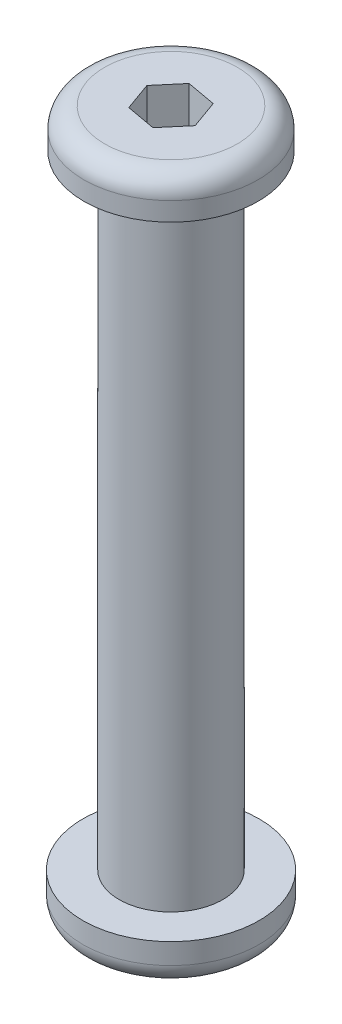
ISO-10303-21;
HEADER;
FILE_DESCRIPTION(('STEP AP214'),'2;1');
FILE_NAME('part.step','',(''),(''),'','','');
FILE_SCHEMA(('AUTOMOTIVE_DESIGN { 1 0 10303 214 1 1 1 1 }'));
ENDSEC;
DATA;
#1=APPLICATION_CONTEXT('core data for automotive mechanical design processes');
#2=APPLICATION_PROTOCOL_DEFINITION('international standard','automotive_design',2000,#1);
#3=PRODUCT_CONTEXT('',#1,'mechanical');
#4=PRODUCT('Part','Part','',(#3));
#5=PRODUCT_RELATED_PRODUCT_CATEGORY('part','',(#4));
#6=PRODUCT_DEFINITION_FORMATION('','',#4);
#7=PRODUCT_DEFINITION_CONTEXT('part definition',#1,'design');
#8=PRODUCT_DEFINITION('design','',#6,#7);
#9=PRODUCT_DEFINITION_SHAPE('','',#8);
#10=(LENGTH_UNIT() NAMED_UNIT(*) SI_UNIT(.MILLI.,.METRE.));
#11=(NAMED_UNIT(*) PLANE_ANGLE_UNIT() SI_UNIT($,.RADIAN.));
#12=(NAMED_UNIT(*) SI_UNIT($,.STERADIAN.) SOLID_ANGLE_UNIT());
#13=UNCERTAINTY_MEASURE_WITH_UNIT(LENGTH_MEASURE(1.E-05),#10,'distance_accuracy_value','');
#14=(GEOMETRIC_REPRESENTATION_CONTEXT(3) GLOBAL_UNCERTAINTY_ASSIGNED_CONTEXT((#13)) GLOBAL_UNIT_ASSIGNED_CONTEXT((#10,
#11,#12)) REPRESENTATION_CONTEXT('',''));
#15=CARTESIAN_POINT('',(0.,0.,0.));
#16=DIRECTION('',(0.,0.,1.));
#17=DIRECTION('',(1.,0.,0.));
#18=AXIS2_PLACEMENT_3D('',#15,#16,#17);
#19=CARTESIAN_POINT('',(0.,30.,0.));
#20=DIRECTION('',(0.,-1.,0.));
#21=DIRECTION('',(0.,0.,-1.));
#22=AXIS2_PLACEMENT_3D('',#19,#20,#21);
#23=CYLINDRICAL_SURFACE('',#22,2.5);
#24=CARTESIAN_POINT('',(0.,30.,0.));
#25=DIRECTION('',(0.,1.,0.));
#26=DIRECTION('',(0.,0.,1.));
#27=AXIS2_PLACEMENT_3D('',#24,#25,#26);
#28=CIRCLE('',#27,2.5);
#29=CARTESIAN_POINT('',(0.,30.,2.5));
#30=VERTEX_POINT('',#29);
#31=EDGE_CURVE('E278',#30,#30,#28,.T.);
#32=ORIENTED_EDGE('',*,*,#31,.F.);
#33=EDGE_LOOP('',(#32));
#34=FACE_BOUND('',#33,.T.);
#35=CARTESIAN_POINT('',(0.,0.,0.));
#36=DIRECTION('',(0.,-1.,0.));
#37=DIRECTION('',(0.,0.,-1.));
#38=AXIS2_PLACEMENT_3D('',#35,#36,#37);
#39=CIRCLE('',#38,2.5);
#40=CARTESIAN_POINT('',(0.,0.,-2.5));
#41=VERTEX_POINT('',#40);
#42=EDGE_CURVE('E210',#41,#41,#39,.T.);
#43=ORIENTED_EDGE('',*,*,#42,.F.);
#44=EDGE_LOOP('',(#43));
#45=FACE_BOUND('',#44,.T.);
#46=ADVANCED_FACE('F43',(#34,#45),#23,.T.);
#47=CARTESIAN_POINT('',(0.,31.9,0.));
#48=DIRECTION('',(0.,1.,0.));
#49=DIRECTION('',(0.,0.,1.));
#50=AXIS2_PLACEMENT_3D('',#47,#48,#49);
#51=PLANE('',#50);
#52=CARTESIAN_POINT('',(0.,31.9,0.));
#53=DIRECTION('',(0.,1.,0.));
#54=DIRECTION('',(0.,0.,1.));
#55=AXIS2_PLACEMENT_3D('',#52,#53,#54);
#56=CIRCLE('',#55,3.2);
#57=CARTESIAN_POINT('',(0.,31.9,3.2));
#58=VERTEX_POINT('',#57);
#59=EDGE_CURVE('E282',#58,#58,#56,.T.);
#60=ORIENTED_EDGE('',*,*,#59,.T.);
#61=EDGE_LOOP('',(#60));
#62=FACE_BOUND('',#61,.T.);
#63=DIRECTION('',(-0.983890145469255,0.,-0.178774107880554));
#64=VECTOR('',#63,1.);
#65=CARTESIAN_POINT('',(0.933529185275309,31.9,-1.10084358270035));
#66=LINE('',#65,#64);
#67=CARTESIAN_POINT('',(0.933529185275309,31.9,-1.10084358270035));
#68=VERTEX_POINT('',#67);
#69=CARTESIAN_POINT('',(-0.486593915573927,31.9,-1.35888178097279));
#70=VERTEX_POINT('',#69);
#71=EDGE_CURVE('E217',#68,#70,#66,.T.);
#72=ORIENTED_EDGE('',*,*,#71,.F.);
#73=DIRECTION('',(-0.337122153771169,0.,-0.941460914449818));
#74=VECTOR('',#73,1.);
#75=CARTESIAN_POINT('',(1.42012310084924,31.9,0.258038198272432));
#76=LINE('',#75,#74);
#77=CARTESIAN_POINT('',(1.42012310084924,31.9,0.258038198272432));
#78=VERTEX_POINT('',#77);
#79=EDGE_CURVE('E214',#78,#68,#76,.T.);
#80=ORIENTED_EDGE('',*,*,#79,.F.);
#81=DIRECTION('',(0.646767991698087,0.,-0.762686806569265));
#82=VECTOR('',#81,1.);
#83=CARTESIAN_POINT('',(0.486593915573928,31.9,1.35888178097278));
#84=LINE('',#83,#82);
#85=CARTESIAN_POINT('',(0.486593915573928,31.9,1.35888178097278));
#86=VERTEX_POINT('',#85);
#87=EDGE_CURVE('E231',#86,#78,#84,.T.);
#88=ORIENTED_EDGE('',*,*,#87,.F.);
#89=DIRECTION('',(0.983890145469255,0.,0.178774107880553));
#90=VECTOR('',#89,1.);
#91=CARTESIAN_POINT('',(-0.933529185275311,31.9,1.10084358270035));
#92=LINE('',#91,#90);
#93=CARTESIAN_POINT('',(-0.933529185275311,31.9,1.10084358270035));
#94=VERTEX_POINT('',#93);
#95=EDGE_CURVE('E227',#94,#86,#92,.T.);
#96=ORIENTED_EDGE('',*,*,#95,.F.);
#97=DIRECTION('',(0.337122153771169,0.,0.941460914449818));
#98=VECTOR('',#97,1.);
#99=CARTESIAN_POINT('',(-1.42012310084924,31.9,-0.258038198272431));
#100=LINE('',#99,#98);
#101=CARTESIAN_POINT('',(-1.42012310084924,31.9,-0.258038198272431));
#102=VERTEX_POINT('',#101);
#103=EDGE_CURVE('E224',#102,#94,#100,.T.);
#104=ORIENTED_EDGE('',*,*,#103,.F.);
#105=DIRECTION('',(-0.646767991698087,0.,0.762686806569266));
#106=VECTOR('',#105,1.);
#107=CARTESIAN_POINT('',(-0.486593915573927,31.9,-1.35888178097279));
#108=LINE('',#107,#106);
#109=EDGE_CURVE('E221',#70,#102,#108,.T.);
#110=ORIENTED_EDGE('',*,*,#109,.F.);
#111=EDGE_LOOP('',(#72,#80,#88,#96,#104,#110));
#112=FACE_BOUND('',#111,.T.);
#113=ADVANCED_FACE('F304',(#62,#112),#51,.T.);
#114=CARTESIAN_POINT('',(0.,30.,0.));
#115=DIRECTION('',(0.,1.,0.));
#116=DIRECTION('',(0.,0.,1.));
#117=AXIS2_PLACEMENT_3D('',#114,#115,#116);
#118=PLANE('',#117);
#119=ORIENTED_EDGE('',*,*,#31,.T.);
#120=EDGE_LOOP('',(#119));
#121=FACE_BOUND('',#120,.T.);
#122=CARTESIAN_POINT('',(0.,30.,0.));
#123=DIRECTION('',(0.,1.,0.));
#124=DIRECTION('',(0.,0.,1.));
#125=AXIS2_PLACEMENT_3D('',#122,#123,#124);
#126=CIRCLE('',#125,4.2);
#127=CARTESIAN_POINT('',(0.,30.,-4.2));
#128=VERTEX_POINT('',#127);
#129=EDGE_CURVE('E274',#128,#128,#126,.T.);
#130=ORIENTED_EDGE('',*,*,#129,.F.);
#131=EDGE_LOOP('',(#130));
#132=FACE_BOUND('',#131,.T.);
#133=ADVANCED_FACE('F310',(#121,#132),#118,.F.);
#134=CARTESIAN_POINT('',(0.,31.9,0.));
#135=DIRECTION('',(0.,-1.,0.));
#136=DIRECTION('',(0.,0.,-1.));
#137=AXIS2_PLACEMENT_3D('',#134,#135,#136);
#138=CYLINDRICAL_SURFACE('',#137,4.2);
#139=CARTESIAN_POINT('',(0.,30.9,0.));
#140=DIRECTION('',(0.,1.,0.));
#141=DIRECTION('',(0.,0.,1.));
#142=AXIS2_PLACEMENT_3D('',#139,#140,#141);
#143=CIRCLE('',#142,4.2);
#144=CARTESIAN_POINT('',(0.,30.9,-4.2));
#145=VERTEX_POINT('',#144);
#146=EDGE_CURVE('E286',#145,#145,#143,.F.);
#147=CARTESIAN_POINT('',(0.,30.9,-4.2));
#148=CARTESIAN_POINT('',(0.,30.890625,-4.2));
#149=CARTESIAN_POINT('',(0.,30.88125,-4.2));
#150=CARTESIAN_POINT('',(0.,30.8625,-4.2));
#151=CARTESIAN_POINT('',(0.,30.853125,-4.2));
#152=CARTESIAN_POINT('',(0.,30.834375,-4.2));
#153=CARTESIAN_POINT('',(0.,30.825,-4.2));
#154=CARTESIAN_POINT('',(0.,30.80625,-4.2));
#155=CARTESIAN_POINT('',(0.,30.796875,-4.2));
#156=CARTESIAN_POINT('',(0.,30.778125,-4.2));
#157=CARTESIAN_POINT('',(0.,30.76875,-4.2));
#158=CARTESIAN_POINT('',(0.,30.75,-4.2));
#159=CARTESIAN_POINT('',(0.,30.740625,-4.2));
#160=CARTESIAN_POINT('',(0.,30.721875,-4.2));
#161=CARTESIAN_POINT('',(0.,30.7125,-4.2));
#162=CARTESIAN_POINT('',(0.,30.69375,-4.2));
#163=CARTESIAN_POINT('',(0.,30.684375,-4.2));
#164=CARTESIAN_POINT('',(0.,30.665625,-4.2));
#165=CARTESIAN_POINT('',(0.,30.65625,-4.2));
#166=CARTESIAN_POINT('',(0.,30.6375,-4.2));
#167=CARTESIAN_POINT('',(0.,30.628125,-4.2));
#168=CARTESIAN_POINT('',(0.,30.609375,-4.2));
#169=CARTESIAN_POINT('',(0.,30.6,-4.2));
#170=CARTESIAN_POINT('',(0.,30.58125,-4.2));
#171=CARTESIAN_POINT('',(0.,30.571875,-4.2));
#172=CARTESIAN_POINT('',(0.,30.553125,-4.2));
#173=CARTESIAN_POINT('',(0.,30.54375,-4.2));
#174=CARTESIAN_POINT('',(0.,30.525,-4.2));
#175=CARTESIAN_POINT('',(0.,30.515625,-4.2));
#176=CARTESIAN_POINT('',(0.,30.496875,-4.2));
#177=CARTESIAN_POINT('',(0.,30.4875,-4.2));
#178=CARTESIAN_POINT('',(0.,30.46875,-4.2));
#179=CARTESIAN_POINT('',(0.,30.459375,-4.2));
#180=CARTESIAN_POINT('',(0.,30.440625,-4.2));
#181=CARTESIAN_POINT('',(0.,30.43125,-4.2));
#182=CARTESIAN_POINT('',(0.,30.4125,-4.2));
#183=CARTESIAN_POINT('',(0.,30.403125,-4.2));
#184=CARTESIAN_POINT('',(0.,30.384375,-4.2));
#185=CARTESIAN_POINT('',(0.,30.375,-4.2));
#186=CARTESIAN_POINT('',(0.,30.35625,-4.2));
#187=CARTESIAN_POINT('',(0.,30.346875,-4.2));
#188=CARTESIAN_POINT('',(0.,30.328125,-4.2));
#189=CARTESIAN_POINT('',(0.,30.31875,-4.2));
#190=CARTESIAN_POINT('',(0.,30.3,-4.2));
#191=CARTESIAN_POINT('',(0.,30.290625,-4.2));
#192=CARTESIAN_POINT('',(0.,30.271875,-4.2));
#193=CARTESIAN_POINT('',(0.,30.2625,-4.2));
#194=CARTESIAN_POINT('',(0.,30.24375,-4.2));
#195=CARTESIAN_POINT('',(0.,30.234375,-4.2));
#196=CARTESIAN_POINT('',(0.,30.215625,-4.2));
#197=CARTESIAN_POINT('',(0.,30.20625,-4.2));
#198=CARTESIAN_POINT('',(0.,30.1875,-4.2));
#199=CARTESIAN_POINT('',(0.,30.178125,-4.2));
#200=CARTESIAN_POINT('',(0.,30.159375,-4.2));
#201=CARTESIAN_POINT('',(0.,30.15,-4.2));
#202=CARTESIAN_POINT('',(0.,30.13125,-4.2));
#203=CARTESIAN_POINT('',(0.,30.121875,-4.2));
#204=CARTESIAN_POINT('',(0.,30.103125,-4.2));
#205=CARTESIAN_POINT('',(0.,30.09375,-4.2));
#206=CARTESIAN_POINT('',(0.,30.075,-4.2));
#207=CARTESIAN_POINT('',(0.,30.065625,-4.2));
#208=CARTESIAN_POINT('',(0.,30.046875,-4.2));
#209=CARTESIAN_POINT('',(0.,30.0375,-4.2));
#210=CARTESIAN_POINT('',(0.,30.01875,-4.2));
#211=CARTESIAN_POINT('',(0.,30.009375,-4.2));
#212=CARTESIAN_POINT('',(0.,30.,-4.2));
#213=B_SPLINE_CURVE_WITH_KNOTS('',3,(#147,#148,#149,#150,#151,#152,#153,#154,#155,#156,#157,
#158,#159,#160,#161,#162,#163,#164,#165,#166,#167,#168,#169,#170,#171,#172,#173,#174,#175,#176,
#177,#178,#179,#180,#181,#182,#183,#184,#185,#186,#187,#188,#189,#190,#191,#192,#193,#194,#195,
#196,#197,#198,#199,#200,#201,#202,#203,#204,#205,#206,#207,#208,#209,#210,#211,#212),
.UNSPECIFIED.,.F.,.F.,(4,2,2,2,2,2,2,2,2,2,2,2,2,2,2,2,2,2,2,2,2,2,2,2,2,2,2,2,2,2,2,2,4),(0.,
0.0281249999999969,0.0562499999999973,0.0843749999999976,0.112499999999998,0.140624999999998,
0.168749999999999,0.196874999999999,0.225,0.253124999999996,0.281249999999997,0.309374999999997,
0.337499999999998,0.365624999999998,0.393749999999998,0.421874999999999,0.449999999999999,
0.478124999999996,0.506249999999996,0.534374999999997,0.562499999999997,0.590624999999997,
0.618749999999998,0.646874999999998,0.674999999999998,0.703124999999995,0.731249999999996,
0.759374999999996,0.787499999999997,0.815624999999997,0.843749999999997,0.871874999999998,
0.899999999999998),.UNSPECIFIED.);
#214=EDGE_CURVE('BSEAM324',#145,#128,#213,.T.);
#215=ORIENTED_EDGE('',*,*,#146,.T.);
#216=ORIENTED_EDGE('',*,*,#129,.T.);
#217=ORIENTED_EDGE('',*,*,#214,.T.);
#218=ORIENTED_EDGE('',*,*,#214,.F.);
#219=EDGE_LOOP('',(#215,#217,#216,#218));
#220=FACE_BOUND('',#219,.T.);
#221=ADVANCED_FACE('F324',(#220),#138,.T.);
#222=CARTESIAN_POINT('',(1.42012310084924,31.9,0.258038198272432));
#223=DIRECTION('',(-0.941460914449818,0.,0.337122153771169));
#224=DIRECTION('',(0.337122153771169,0.,0.941460914449819));
#225=AXIS2_PLACEMENT_3D('',#222,#223,#224);
#226=PLANE('',#225);
#227=DIRECTION('',(-0.337122153771169,0.,-0.941460914449818));
#228=VECTOR('',#227,1.);
#229=CARTESIAN_POINT('',(1.42012310084924,30.,0.258038198272432));
#230=LINE('',#229,#228);
#231=CARTESIAN_POINT('',(1.42012310084924,30.,0.258038198272432));
#232=VERTEX_POINT('',#231);
#233=CARTESIAN_POINT('',(0.933529185275309,30.,-1.10084358270035));
#234=VERTEX_POINT('',#233);
#235=EDGE_CURVE('E67',#232,#234,#230,.T.);
#236=ORIENTED_EDGE('',*,*,#235,.F.);
#237=DIRECTION('',(0.,-1.,0.));
#238=VECTOR('',#237,1.);
#239=CARTESIAN_POINT('',(1.42012310084924,31.9,0.258038198272432));
#240=LINE('',#239,#238);
#241=EDGE_CURVE('E234',#78,#232,#240,.T.);
#242=ORIENTED_EDGE('',*,*,#241,.F.);
#243=ORIENTED_EDGE('',*,*,#79,.T.);
#244=DIRECTION('',(0.,-1.,0.));
#245=VECTOR('',#244,1.);
#246=CARTESIAN_POINT('',(0.933529185275309,31.9,-1.10084358270035));
#247=LINE('',#246,#245);
#248=EDGE_CURVE('E270',#68,#234,#247,.T.);
#249=ORIENTED_EDGE('',*,*,#248,.T.);
#250=EDGE_LOOP('',(#236,#242,#243,#249));
#251=FACE_BOUND('',#250,.T.);
#252=ADVANCED_FACE('F327',(#251),#226,.T.);
#253=CARTESIAN_POINT('',(0.933529185275309,31.9,-1.10084358270035));
#254=DIRECTION('',(-0.178774107880554,0.,0.983890145469255));
#255=DIRECTION('',(0.983890145469255,0.,0.178774107880554));
#256=AXIS2_PLACEMENT_3D('',#253,#254,#255);
#257=PLANE('',#256);
#258=DIRECTION('',(-0.983890145469255,0.,-0.178774107880554));
#259=VECTOR('',#258,1.);
#260=CARTESIAN_POINT('',(0.933529185275309,30.,-1.10084358270035));
#261=LINE('',#260,#259);
#262=CARTESIAN_POINT('',(-0.486593915573927,30.,-1.35888178097279));
#263=VERTEX_POINT('',#262);
#264=EDGE_CURVE('E237',#234,#263,#261,.T.);
#265=ORIENTED_EDGE('',*,*,#264,.F.);
#266=ORIENTED_EDGE('',*,*,#248,.F.);
#267=ORIENTED_EDGE('',*,*,#71,.T.);
#268=DIRECTION('',(0.,-1.,0.));
#269=VECTOR('',#268,1.);
#270=CARTESIAN_POINT('',(-0.486593915573927,31.9,-1.35888178097279));
#271=LINE('',#270,#269);
#272=EDGE_CURVE('E266',#70,#263,#271,.T.);
#273=ORIENTED_EDGE('',*,*,#272,.T.);
#274=EDGE_LOOP('',(#265,#266,#267,#273));
#275=FACE_BOUND('',#274,.T.);
#276=ADVANCED_FACE('F334',(#275),#257,.T.);
#277=CARTESIAN_POINT('',(-0.486593915573927,31.9,-1.35888178097279));
#278=DIRECTION('',(0.762686806569265,0.,0.646767991698086));
#279=DIRECTION('',(0.646767991698086,0.,-0.762686806569266));
#280=AXIS2_PLACEMENT_3D('',#277,#278,#279);
#281=PLANE('',#280);
#282=DIRECTION('',(-0.646767991698087,0.,0.762686806569266));
#283=VECTOR('',#282,1.);
#284=CARTESIAN_POINT('',(-0.486593915573927,30.,-1.35888178097279));
#285=LINE('',#284,#283);
#286=CARTESIAN_POINT('',(-1.42012310084924,30.,-0.258038198272431));
#287=VERTEX_POINT('',#286);
#288=EDGE_CURVE('E240',#263,#287,#285,.T.);
#289=ORIENTED_EDGE('',*,*,#288,.F.);
#290=ORIENTED_EDGE('',*,*,#272,.F.);
#291=ORIENTED_EDGE('',*,*,#109,.T.);
#292=DIRECTION('',(0.,-1.,0.));
#293=VECTOR('',#292,1.);
#294=CARTESIAN_POINT('',(-1.42012310084924,31.9,-0.258038198272431));
#295=LINE('',#294,#293);
#296=EDGE_CURVE('E262',#102,#287,#295,.T.);
#297=ORIENTED_EDGE('',*,*,#296,.T.);
#298=EDGE_LOOP('',(#289,#290,#291,#297));
#299=FACE_BOUND('',#298,.T.);
#300=ADVANCED_FACE('F338',(#299),#281,.T.);
#301=CARTESIAN_POINT('',(-1.42012310084924,31.9,-0.258038198272431));
#302=DIRECTION('',(0.941460914449818,0.,-0.337122153771169));
#303=DIRECTION('',(-0.337122153771169,0.,-0.941460914449818));
#304=AXIS2_PLACEMENT_3D('',#301,#302,#303);
#305=PLANE('',#304);
#306=DIRECTION('',(0.337122153771169,0.,0.941460914449818));
#307=VECTOR('',#306,1.);
#308=CARTESIAN_POINT('',(-1.42012310084924,30.,-0.258038198272431));
#309=LINE('',#308,#307);
#310=CARTESIAN_POINT('',(-0.933529185275311,30.,1.10084358270035));
#311=VERTEX_POINT('',#310);
#312=EDGE_CURVE('E243',#287,#311,#309,.T.);
#313=ORIENTED_EDGE('',*,*,#312,.F.);
#314=ORIENTED_EDGE('',*,*,#296,.F.);
#315=ORIENTED_EDGE('',*,*,#103,.T.);
#316=DIRECTION('',(0.,-1.,0.));
#317=VECTOR('',#316,1.);
#318=CARTESIAN_POINT('',(-0.933529185275311,31.9,1.10084358270035));
#319=LINE('',#318,#317);
#320=EDGE_CURVE('E258',#94,#311,#319,.T.);
#321=ORIENTED_EDGE('',*,*,#320,.T.);
#322=EDGE_LOOP('',(#313,#314,#315,#321));
#323=FACE_BOUND('',#322,.T.);
#324=ADVANCED_FACE('F342',(#323),#305,.T.);
#325=CARTESIAN_POINT('',(-0.933529185275311,31.9,1.10084358270035));
#326=DIRECTION('',(0.178774107880553,0.,-0.983890145469255));
#327=DIRECTION('',(-0.983890145469255,0.,-0.178774107880553));
#328=AXIS2_PLACEMENT_3D('',#325,#326,#327);
#329=PLANE('',#328);
#330=DIRECTION('',(0.983890145469255,0.,0.178774107880553));
#331=VECTOR('',#330,1.);
#332=CARTESIAN_POINT('',(-0.933529185275311,30.,1.10084358270035));
#333=LINE('',#332,#331);
#334=CARTESIAN_POINT('',(0.486593915573928,30.,1.35888178097278));
#335=VERTEX_POINT('',#334);
#336=EDGE_CURVE('E246',#311,#335,#333,.T.);
#337=ORIENTED_EDGE('',*,*,#336,.F.);
#338=ORIENTED_EDGE('',*,*,#320,.F.);
#339=ORIENTED_EDGE('',*,*,#95,.T.);
#340=DIRECTION('',(0.,-1.,0.));
#341=VECTOR('',#340,1.);
#342=CARTESIAN_POINT('',(0.486593915573928,31.9,1.35888178097278));
#343=LINE('',#342,#341);
#344=EDGE_CURVE('E254',#86,#335,#343,.T.);
#345=ORIENTED_EDGE('',*,*,#344,.T.);
#346=EDGE_LOOP('',(#337,#338,#339,#345));
#347=FACE_BOUND('',#346,.T.);
#348=ADVANCED_FACE('F346',(#347),#329,.T.);
#349=CARTESIAN_POINT('',(0.486593915573928,31.9,1.35888178097278));
#350=DIRECTION('',(-0.762686806569265,0.,-0.646767991698086));
#351=DIRECTION('',(-0.646767991698087,0.,0.762686806569265));
#352=AXIS2_PLACEMENT_3D('',#349,#350,#351);
#353=PLANE('',#352);
#354=DIRECTION('',(0.646767991698087,0.,-0.762686806569265));
#355=VECTOR('',#354,1.);
#356=CARTESIAN_POINT('',(0.486593915573928,30.,1.35888178097278));
#357=LINE('',#356,#355);
#358=EDGE_CURVE('E218',#335,#232,#357,.T.);
#359=ORIENTED_EDGE('',*,*,#358,.F.);
#360=ORIENTED_EDGE('',*,*,#344,.F.);
#361=ORIENTED_EDGE('',*,*,#87,.T.);
#362=ORIENTED_EDGE('',*,*,#241,.T.);
#363=EDGE_LOOP('',(#359,#360,#361,#362));
#364=FACE_BOUND('',#363,.T.);
#365=ADVANCED_FACE('F323',(#364),#353,.T.);
#366=CARTESIAN_POINT('',(0.,30.,0.));
#367=DIRECTION('',(0.,1.,0.));
#368=DIRECTION('',(0.,0.,1.));
#369=AXIS2_PLACEMENT_3D('',#366,#367,#368);
#370=PLANE('',#369);
#371=ORIENTED_EDGE('',*,*,#235,.T.);
#372=ORIENTED_EDGE('',*,*,#264,.T.);
#373=ORIENTED_EDGE('',*,*,#288,.T.);
#374=ORIENTED_EDGE('',*,*,#312,.T.);
#375=ORIENTED_EDGE('',*,*,#336,.T.);
#376=ORIENTED_EDGE('',*,*,#358,.T.);
#377=EDGE_LOOP('',(#371,#372,#373,#374,#375,#376));
#378=FACE_BOUND('',#377,.T.);
#379=ADVANCED_FACE('F320',(#378),#370,.T.);
#380=CARTESIAN_POINT('',(0.,-2.,0.));
#381=DIRECTION('',(0.,-1.,0.));
#382=DIRECTION('',(0.,0.,-1.));
#383=AXIS2_PLACEMENT_3D('',#380,#381,#382);
#384=PLANE('',#383);
#385=CARTESIAN_POINT('',(0.,-2.,0.));
#386=DIRECTION('',(0.,-1.,0.));
#387=DIRECTION('',(0.,0.,-1.));
#388=AXIS2_PLACEMENT_3D('',#385,#386,#387);
#389=CIRCLE('',#388,3.25);
#390=CARTESIAN_POINT('',(0.,-2.,-3.25));
#391=VERTEX_POINT('',#390);
#392=EDGE_CURVE('E52',#391,#391,#389,.T.);
#393=ORIENTED_EDGE('',*,*,#392,.T.);
#394=EDGE_LOOP('',(#393));
#395=FACE_BOUND('',#394,.T.);
#396=DIRECTION('',(-0.995901214221312,0.,0.0904476175060285));
#397=VECTOR('',#396,1.);
#398=CARTESIAN_POINT('',(0.831789314528723,-2.,1.17960157238331));
#399=LINE('',#398,#397);
#400=CARTESIAN_POINT('',(0.831789314528723,-2.,1.17960157238331));
#401=VERTEX_POINT('',#400);
#402=CARTESIAN_POINT('',(-0.605670270763652,-2.,1.31015146316997));
#403=VERTEX_POINT('',#402);
#404=EDGE_CURVE('E143',#401,#403,#399,.T.);
#405=ORIENTED_EDGE('',*,*,#404,.F.);
#406=DIRECTION('',(-0.419620672638657,0.,0.907699559928439));
#407=VECTOR('',#406,1.);
#408=CARTESIAN_POINT('',(1.43745958529237,-2.,-0.130549890786665));
#409=LINE('',#408,#407);
#410=CARTESIAN_POINT('',(1.43745958529237,-2.,-0.130549890786665));
#411=VERTEX_POINT('',#410);
#412=EDGE_CURVE('E134',#411,#401,#409,.T.);
#413=ORIENTED_EDGE('',*,*,#412,.F.);
#414=DIRECTION('',(0.576280541582655,0.,0.81725194242241));
#415=VECTOR('',#414,1.);
#416=CARTESIAN_POINT('',(0.605670270763651,-2.,-1.31015146316997));
#417=LINE('',#416,#415);
#418=CARTESIAN_POINT('',(0.605670270763652,-2.,-1.31015146316997));
#419=VERTEX_POINT('',#418);
#420=EDGE_CURVE('E171',#419,#411,#417,.T.);
#421=ORIENTED_EDGE('',*,*,#420,.F.);
#422=DIRECTION('',(0.995901214221312,0.,-0.090447617506028));
#423=VECTOR('',#422,1.);
#424=CARTESIAN_POINT('',(-0.831789314528721,-2.,-1.17960157238331));
#425=LINE('',#424,#423);
#426=CARTESIAN_POINT('',(-0.831789314528721,-2.,-1.17960157238331));
#427=VERTEX_POINT('',#426);
#428=EDGE_CURVE('E167',#427,#419,#425,.T.);
#429=ORIENTED_EDGE('',*,*,#428,.F.);
#430=DIRECTION('',(0.419620672638657,0.,-0.907699559928439));
#431=VECTOR('',#430,1.);
#432=CARTESIAN_POINT('',(-1.43745958529237,-2.,0.130549890786665));
#433=LINE('',#432,#431);
#434=CARTESIAN_POINT('',(-1.43745958529237,-2.,0.130549890786665));
#435=VERTEX_POINT('',#434);
#436=EDGE_CURVE('E162',#435,#427,#433,.T.);
#437=ORIENTED_EDGE('',*,*,#436,.F.);
#438=DIRECTION('',(-0.576280541582654,0.,-0.81725194242241));
#439=VECTOR('',#438,1.);
#440=CARTESIAN_POINT('',(-0.605670270763652,-2.,1.31015146316997));
#441=LINE('',#440,#439);
#442=EDGE_CURVE('E158',#403,#435,#441,.T.);
#443=ORIENTED_EDGE('',*,*,#442,.F.);
#444=EDGE_LOOP('',(#405,#413,#421,#429,#437,#443));
#445=FACE_BOUND('',#444,.T.);
#446=ADVANCED_FACE('F156',(#395,#445),#384,.T.);
#447=CARTESIAN_POINT('',(0.,0.,0.));
#448=DIRECTION('',(0.,-1.,0.));
#449=DIRECTION('',(0.,0.,-1.));
#450=AXIS2_PLACEMENT_3D('',#447,#448,#449);
#451=PLANE('',#450);
#452=ORIENTED_EDGE('',*,*,#42,.T.);
#453=EDGE_LOOP('',(#452));
#454=FACE_BOUND('',#453,.T.);
#455=CARTESIAN_POINT('',(0.,0.,0.));
#456=DIRECTION('',(0.,-1.,0.));
#457=DIRECTION('',(0.,0.,-1.));
#458=AXIS2_PLACEMENT_3D('',#455,#456,#457);
#459=CIRCLE('',#458,4.25);
#460=CARTESIAN_POINT('',(0.,0.,-4.25));
#461=VERTEX_POINT('',#460);
#462=EDGE_CURVE('E152',#461,#461,#459,.T.);
#463=ORIENTED_EDGE('',*,*,#462,.F.);
#464=EDGE_LOOP('',(#463));
#465=FACE_BOUND('',#464,.T.);
#466=ADVANCED_FACE('F357',(#454,#465),#451,.F.);
#467=CARTESIAN_POINT('',(0.,-2.,0.));
#468=DIRECTION('',(0.,1.,0.));
#469=DIRECTION('',(0.,0.,1.));
#470=AXIS2_PLACEMENT_3D('',#467,#468,#469);
#471=CYLINDRICAL_SURFACE('',#470,4.25);
#472=CARTESIAN_POINT('',(0.,-1.,0.));
#473=DIRECTION('',(0.,-1.,0.));
#474=DIRECTION('',(0.,0.,-1.));
#475=AXIS2_PLACEMENT_3D('',#472,#473,#474);
#476=CIRCLE('',#475,4.25);
#477=CARTESIAN_POINT('',(0.,-1.,-4.25));
#478=VERTEX_POINT('',#477);
#479=EDGE_CURVE('E11',#478,#478,#476,.F.);
#480=ORIENTED_EDGE('',*,*,#479,.T.);
#481=EDGE_LOOP('',(#480));
#482=FACE_BOUND('',#481,.T.);
#483=ORIENTED_EDGE('',*,*,#462,.T.);
#484=EDGE_LOOP('',(#483));
#485=FACE_BOUND('',#484,.T.);
#486=ADVANCED_FACE('F354',(#482,#485),#471,.T.);
#487=CARTESIAN_POINT('',(1.43745958529237,-2.,-0.130549890786665));
#488=DIRECTION('',(-0.907699559928439,0.,-0.419620672638657));
#489=DIRECTION('',(-0.419620672638657,0.,0.907699559928439));
#490=AXIS2_PLACEMENT_3D('',#487,#488,#489);
#491=PLANE('',#490);
#492=DIRECTION('',(-0.419620672638657,0.,0.907699559928439));
#493=VECTOR('',#492,1.);
#494=CARTESIAN_POINT('',(1.43745958529237,0.,-0.130549890786665));
#495=LINE('',#494,#493);
#496=CARTESIAN_POINT('',(1.43745958529237,0.,-0.130549890786665));
#497=VERTEX_POINT('',#496);
#498=CARTESIAN_POINT('',(0.831789314528723,0.,1.17960157238331));
#499=VERTEX_POINT('',#498);
#500=EDGE_CURVE('E174',#497,#499,#495,.T.);
#501=ORIENTED_EDGE('',*,*,#500,.F.);
#502=DIRECTION('',(0.,1.,0.));
#503=VECTOR('',#502,1.);
#504=CARTESIAN_POINT('',(1.43745958529237,-2.,-0.130549890786665));
#505=LINE('',#504,#503);
#506=EDGE_CURVE('E59',#411,#497,#505,.T.);
#507=ORIENTED_EDGE('',*,*,#506,.F.);
#508=ORIENTED_EDGE('',*,*,#412,.T.);
#509=DIRECTION('',(0.,1.,0.));
#510=VECTOR('',#509,1.);
#511=CARTESIAN_POINT('',(0.831789314528723,-2.,1.17960157238331));
#512=LINE('',#511,#510);
#513=EDGE_CURVE('E137',#401,#499,#512,.T.);
#514=ORIENTED_EDGE('',*,*,#513,.T.);
#515=EDGE_LOOP('',(#501,#507,#508,#514));
#516=FACE_BOUND('',#515,.T.);
#517=ADVANCED_FACE('F136',(#516),#491,.T.);
#518=CARTESIAN_POINT('',(0.831789314528723,-2.,1.17960157238331));
#519=DIRECTION('',(-0.0904476175060285,0.,-0.995901214221312));
#520=DIRECTION('',(-0.995901214221312,0.,0.0904476175060285));
#521=AXIS2_PLACEMENT_3D('',#518,#519,#520);
#522=PLANE('',#521);
#523=DIRECTION('',(-0.995901214221312,0.,0.0904476175060285));
#524=VECTOR('',#523,1.);
#525=CARTESIAN_POINT('',(0.831789314528723,0.,1.17960157238331));
#526=LINE('',#525,#524);
#527=CARTESIAN_POINT('',(-0.605670270763652,0.,1.31015146316997));
#528=VERTEX_POINT('',#527);
#529=EDGE_CURVE('E150',#499,#528,#526,.T.);
#530=ORIENTED_EDGE('',*,*,#529,.F.);
#531=ORIENTED_EDGE('',*,*,#513,.F.);
#532=ORIENTED_EDGE('',*,*,#404,.T.);
#533=DIRECTION('',(0.,1.,0.));
#534=VECTOR('',#533,1.);
#535=CARTESIAN_POINT('',(-0.605670270763652,-2.,1.31015146316997));
#536=LINE('',#535,#534);
#537=EDGE_CURVE('E153',#403,#528,#536,.T.);
#538=ORIENTED_EDGE('',*,*,#537,.T.);
#539=EDGE_LOOP('',(#530,#531,#532,#538));
#540=FACE_BOUND('',#539,.T.);
#541=ADVANCED_FACE('F147',(#540),#522,.T.);
#542=CARTESIAN_POINT('',(-0.605670270763652,-2.,1.31015146316997));
#543=DIRECTION('',(0.81725194242241,0.,-0.576280541582654));
#544=DIRECTION('',(-0.576280541582654,0.,-0.81725194242241));
#545=AXIS2_PLACEMENT_3D('',#542,#543,#544);
#546=PLANE('',#545);
#547=DIRECTION('',(-0.576280541582654,0.,-0.81725194242241));
#548=VECTOR('',#547,1.);
#549=CARTESIAN_POINT('',(-0.605670270763652,0.,1.31015146316997));
#550=LINE('',#549,#548);
#551=CARTESIAN_POINT('',(-1.43745958529237,0.,0.130549890786665));
#552=VERTEX_POINT('',#551);
#553=EDGE_CURVE('E179',#528,#552,#550,.T.);
#554=ORIENTED_EDGE('',*,*,#553,.F.);
#555=ORIENTED_EDGE('',*,*,#537,.F.);
#556=ORIENTED_EDGE('',*,*,#442,.T.);
#557=DIRECTION('',(0.,1.,0.));
#558=VECTOR('',#557,1.);
#559=CARTESIAN_POINT('',(-1.43745958529237,-2.,0.130549890786665));
#560=LINE('',#559,#558);
#561=EDGE_CURVE('E202',#435,#552,#560,.T.);
#562=ORIENTED_EDGE('',*,*,#561,.T.);
#563=EDGE_LOOP('',(#554,#555,#556,#562));
#564=FACE_BOUND('',#563,.T.);
#565=ADVANCED_FACE('F368',(#564),#546,.T.);
#566=CARTESIAN_POINT('',(-1.43745958529237,-2.,0.130549890786665));
#567=DIRECTION('',(0.907699559928438,0.,0.419620672638657));
#568=DIRECTION('',(0.419620672638657,0.,-0.907699559928439));
#569=AXIS2_PLACEMENT_3D('',#566,#567,#568);
#570=PLANE('',#569);
#571=DIRECTION('',(0.419620672638657,0.,-0.907699559928439));
#572=VECTOR('',#571,1.);
#573=CARTESIAN_POINT('',(-1.43745958529237,0.,0.130549890786665));
#574=LINE('',#573,#572);
#575=CARTESIAN_POINT('',(-0.831789314528721,0.,-1.17960157238331));
#576=VERTEX_POINT('',#575);
#577=EDGE_CURVE('E183',#552,#576,#574,.T.);
#578=ORIENTED_EDGE('',*,*,#577,.F.);
#579=ORIENTED_EDGE('',*,*,#561,.F.);
#580=ORIENTED_EDGE('',*,*,#436,.T.);
#581=DIRECTION('',(0.,1.,0.));
#582=VECTOR('',#581,1.);
#583=CARTESIAN_POINT('',(-0.831789314528721,-2.,-1.17960157238331));
#584=LINE('',#583,#582);
#585=EDGE_CURVE('E199',#427,#576,#584,.T.);
#586=ORIENTED_EDGE('',*,*,#585,.T.);
#587=EDGE_LOOP('',(#578,#579,#580,#586));
#588=FACE_BOUND('',#587,.T.);
#589=ADVANCED_FACE('F371',(#588),#570,.T.);
#590=CARTESIAN_POINT('',(-0.831789314528721,-2.,-1.17960157238331));
#591=DIRECTION('',(0.090447617506028,0.,0.995901214221312));
#592=DIRECTION('',(0.995901214221312,0.,-0.090447617506028));
#593=AXIS2_PLACEMENT_3D('',#590,#591,#592);
#594=PLANE('',#593);
#595=DIRECTION('',(0.995901214221312,0.,-0.090447617506028));
#596=VECTOR('',#595,1.);
#597=CARTESIAN_POINT('',(-0.831789314528721,0.,-1.17960157238331));
#598=LINE('',#597,#596);
#599=CARTESIAN_POINT('',(0.605670270763651,0.,-1.31015146316997));
#600=VERTEX_POINT('',#599);
#601=EDGE_CURVE('E187',#576,#600,#598,.T.);
#602=ORIENTED_EDGE('',*,*,#601,.F.);
#603=ORIENTED_EDGE('',*,*,#585,.F.);
#604=ORIENTED_EDGE('',*,*,#428,.T.);
#605=DIRECTION('',(0.,1.,0.));
#606=VECTOR('',#605,1.);
#607=CARTESIAN_POINT('',(0.605670270763651,-2.,-1.31015146316997));
#608=LINE('',#607,#606);
#609=EDGE_CURVE('E196',#419,#600,#608,.T.);
#610=ORIENTED_EDGE('',*,*,#609,.T.);
#611=EDGE_LOOP('',(#602,#603,#604,#610));
#612=FACE_BOUND('',#611,.T.);
#613=ADVANCED_FACE('F375',(#612),#594,.T.);
#614=CARTESIAN_POINT('',(0.605670270763651,-2.,-1.31015146316997));
#615=DIRECTION('',(-0.81725194242241,0.,0.576280541582655));
#616=DIRECTION('',(0.576280541582655,0.,0.81725194242241));
#617=AXIS2_PLACEMENT_3D('',#614,#615,#616);
#618=PLANE('',#617);
#619=DIRECTION('',(0.576280541582655,0.,0.81725194242241));
#620=VECTOR('',#619,1.);
#621=CARTESIAN_POINT('',(0.605670270763651,0.,-1.31015146316997));
#622=LINE('',#621,#620);
#623=EDGE_CURVE('E144',#600,#497,#622,.T.);
#624=ORIENTED_EDGE('',*,*,#623,.F.);
#625=ORIENTED_EDGE('',*,*,#609,.F.);
#626=ORIENTED_EDGE('',*,*,#420,.T.);
#627=ORIENTED_EDGE('',*,*,#506,.T.);
#628=EDGE_LOOP('',(#624,#625,#626,#627));
#629=FACE_BOUND('',#628,.T.);
#630=ADVANCED_FACE('F318',(#629),#618,.T.);
#631=CARTESIAN_POINT('',(0.,0.,0.));
#632=DIRECTION('',(0.,1.,0.));
#633=DIRECTION('',(0.,0.,1.));
#634=AXIS2_PLACEMENT_3D('',#631,#632,#633);
#635=PLANE('',#634);
#636=ORIENTED_EDGE('',*,*,#623,.T.);
#637=ORIENTED_EDGE('',*,*,#500,.T.);
#638=ORIENTED_EDGE('',*,*,#529,.T.);
#639=ORIENTED_EDGE('',*,*,#553,.T.);
#640=ORIENTED_EDGE('',*,*,#577,.T.);
#641=ORIENTED_EDGE('',*,*,#601,.T.);
#642=EDGE_LOOP('',(#636,#637,#638,#639,#640,#641));
#643=FACE_BOUND('',#642,.T.);
#644=ADVANCED_FACE('F300',(#643),#635,.F.);
#645=CARTESIAN_POINT('',(0.,30.9,0.));
#646=DIRECTION('',(0.,1.,0.));
#647=DIRECTION('',(0.,0.,1.));
#648=AXIS2_PLACEMENT_3D('',#645,#646,#647);
#649=TOROIDAL_SURFACE('',#648,3.2,1.);
#650=ORIENTED_EDGE('',*,*,#146,.F.);
#651=EDGE_LOOP('',(#650));
#652=FACE_BOUND('',#651,.T.);
#653=ORIENTED_EDGE('',*,*,#59,.F.);
#654=EDGE_LOOP('',(#653));
#655=FACE_BOUND('',#654,.T.);
#656=ADVANCED_FACE('F295',(#652,#655),#649,.T.);
#657=CARTESIAN_POINT('',(0.,-1.,0.));
#658=DIRECTION('',(0.,-1.,0.));
#659=DIRECTION('',(0.,0.,-1.));
#660=AXIS2_PLACEMENT_3D('',#657,#658,#659);
#661=TOROIDAL_SURFACE('',#660,3.25,1.);
#662=ORIENTED_EDGE('',*,*,#479,.F.);
#663=EDGE_LOOP('',(#662));
#664=FACE_BOUND('',#663,.T.);
#665=ORIENTED_EDGE('',*,*,#392,.F.);
#666=EDGE_LOOP('',(#665));
#667=FACE_BOUND('',#666,.T.);
#668=ADVANCED_FACE('F45',(#664,#667),#661,.T.);
#669=CLOSED_SHELL('',(#46,#113,#133,#221,#252,#276,#300,#324,#348,#365,#379,#446,#466,#486,#517,
#541,#565,#589,#613,#630,#644,#656,#668));
#670=MANIFOLD_SOLID_BREP('B2',#669);
#671=ADVANCED_BREP_SHAPE_REPRESENTATION('',(#18,#670),#14);
#672=SHAPE_DEFINITION_REPRESENTATION(#9,#671);
ENDSEC;
END-ISO-10303-21;
